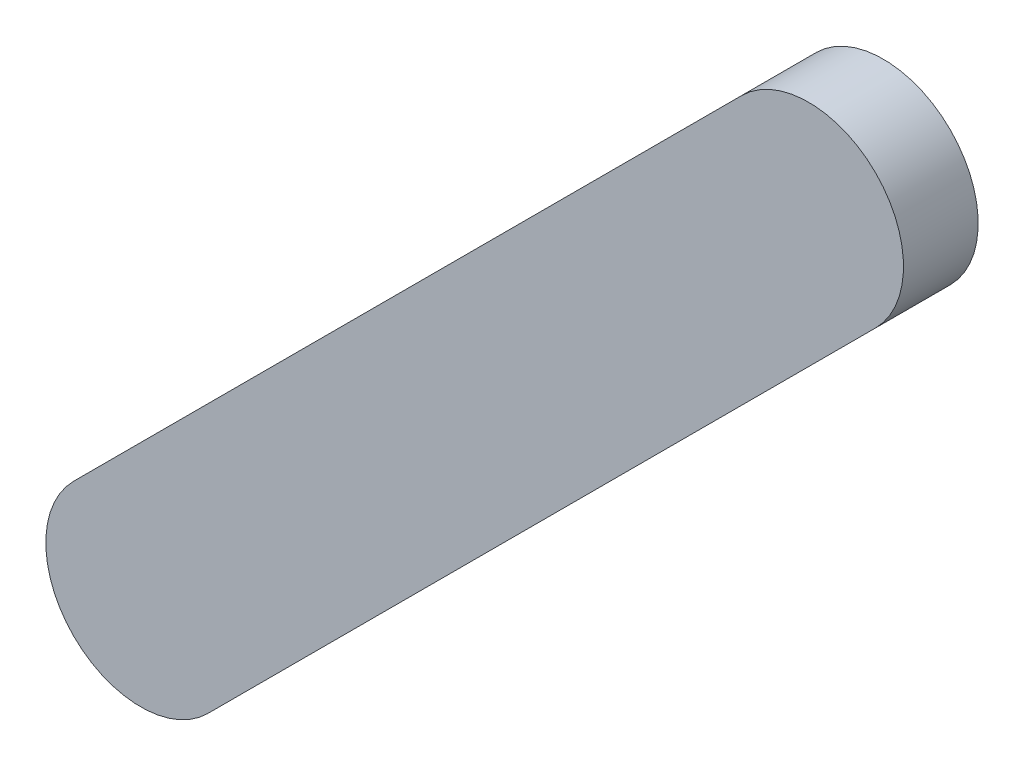
ISO-10303-21;
HEADER;
FILE_DESCRIPTION(('STEP AP214'),'2;1');
FILE_NAME('part.step','',(''),(''),'','','');
FILE_SCHEMA(('AUTOMOTIVE_DESIGN { 1 0 10303 214 1 1 1 1 }'));
ENDSEC;
DATA;
#1=APPLICATION_CONTEXT('core data for automotive mechanical design processes');
#2=APPLICATION_PROTOCOL_DEFINITION('international standard','automotive_design',2000,#1);
#3=PRODUCT_CONTEXT('',#1,'mechanical');
#4=PRODUCT('Part','Part','',(#3));
#5=PRODUCT_RELATED_PRODUCT_CATEGORY('part','',(#4));
#6=PRODUCT_DEFINITION_FORMATION('','',#4);
#7=PRODUCT_DEFINITION_CONTEXT('part definition',#1,'design');
#8=PRODUCT_DEFINITION('design','',#6,#7);
#9=PRODUCT_DEFINITION_SHAPE('','',#8);
#10=(LENGTH_UNIT() NAMED_UNIT(*) SI_UNIT(.MILLI.,.METRE.));
#11=(NAMED_UNIT(*) PLANE_ANGLE_UNIT() SI_UNIT($,.RADIAN.));
#12=(NAMED_UNIT(*) SI_UNIT($,.STERADIAN.) SOLID_ANGLE_UNIT());
#13=UNCERTAINTY_MEASURE_WITH_UNIT(LENGTH_MEASURE(1.E-05),#10,'distance_accuracy_value','');
#14=(GEOMETRIC_REPRESENTATION_CONTEXT(3) GLOBAL_UNCERTAINTY_ASSIGNED_CONTEXT((#13)) GLOBAL_UNIT_ASSIGNED_CONTEXT((#10,
#11,#12)) REPRESENTATION_CONTEXT('',''));
#15=CARTESIAN_POINT('',(0.,0.,0.));
#16=DIRECTION('',(0.,0.,1.));
#17=DIRECTION('',(1.,0.,0.));
#18=AXIS2_PLACEMENT_3D('',#15,#16,#17);
#19=CARTESIAN_POINT('',(153.9656052,101.79039586,0.));
#20=DIRECTION('',(-0.707106781186545,0.70710678118655,0.));
#21=DIRECTION('',(0.70710678118655,0.707106781186545,0.));
#22=AXIS2_PLACEMENT_3D('',#19,#20,#21);
#23=PLANE('',#22);
#24=DIRECTION('',(0.70710678118655,0.707106781186545,0.));
#25=VECTOR('',#24,1.);
#26=CARTESIAN_POINT('',(153.9656052,101.79039586,0.1999996));
#27=LINE('',#26,#25);
#28=CARTESIAN_POINT('',(153.9656052,101.79039586,0.1999996));
#29=VERTEX_POINT('',#28);
#30=CARTESIAN_POINT('',(155.75460594,103.5793966,0.1999996));
#31=VERTEX_POINT('',#30);
#32=EDGE_CURVE('E11',#29,#31,#27,.T.);
#33=ORIENTED_EDGE('',*,*,#32,.F.);
#34=DIRECTION('',(0.,0.,1.));
#35=VECTOR('',#34,1.);
#36=CARTESIAN_POINT('',(153.9656052,101.79039586,0.));
#37=LINE('',#36,#35);
#38=CARTESIAN_POINT('',(153.9656052,101.79039586,0.));
#39=VERTEX_POINT('',#38);
#40=EDGE_CURVE('E24',#39,#29,#37,.T.);
#41=ORIENTED_EDGE('',*,*,#40,.F.);
#42=DIRECTION('',(0.70710678118655,0.707106781186545,0.));
#43=VECTOR('',#42,1.);
#44=CARTESIAN_POINT('',(153.9656052,101.79039586,0.));
#45=LINE('',#44,#43);
#46=CARTESIAN_POINT('',(155.75460594,103.5793966,0.));
#47=VERTEX_POINT('',#46);
#48=EDGE_CURVE('E75',#39,#47,#45,.T.);
#49=ORIENTED_EDGE('',*,*,#48,.T.);
#50=DIRECTION('',(0.,0.,1.));
#51=VECTOR('',#50,1.);
#52=CARTESIAN_POINT('',(155.75460594,103.5793966,0.));
#53=LINE('',#52,#51);
#54=EDGE_CURVE('E37',#47,#31,#53,.T.);
#55=ORIENTED_EDGE('',*,*,#54,.T.);
#56=EDGE_LOOP('',(#33,#41,#49,#55));
#57=FACE_BOUND('',#56,.T.);
#58=ADVANCED_FACE('F17',(#57),#23,.F.);
#59=CARTESIAN_POINT('',(155.57500127,103.75900127,0.));
#60=DIRECTION('',(0.,0.,-1.));
#61=DIRECTION('',(0.707106781186548,-0.707106781186548,0.));
#62=AXIS2_PLACEMENT_3D('',#59,#60,#61);
#63=CYLINDRICAL_SURFACE('',#62,0.253999360179542);
#64=CARTESIAN_POINT('',(155.57500127,103.75900127,0.1999996));
#65=DIRECTION('',(0.,0.,1.));
#66=DIRECTION('',(0.707106781186548,-0.707106781186548,0.));
#67=AXIS2_PLACEMENT_3D('',#64,#65,#66);
#68=CIRCLE('',#67,0.253999360179542);
#69=CARTESIAN_POINT('',(155.3953966,103.93860594,0.1999996));
#70=VERTEX_POINT('',#69);
#71=EDGE_CURVE('E83',#31,#70,#68,.T.);
#72=ORIENTED_EDGE('',*,*,#71,.F.);
#73=ORIENTED_EDGE('',*,*,#54,.F.);
#74=CARTESIAN_POINT('',(155.57500127,103.75900127,0.));
#75=DIRECTION('',(0.,0.,1.));
#76=DIRECTION('',(0.707106781186548,-0.707106781186548,0.));
#77=AXIS2_PLACEMENT_3D('',#74,#75,#76);
#78=CIRCLE('',#77,0.253999360179542);
#79=CARTESIAN_POINT('',(155.3953966,103.93860594,0.));
#80=VERTEX_POINT('',#79);
#81=EDGE_CURVE('E81',#47,#80,#78,.T.);
#82=ORIENTED_EDGE('',*,*,#81,.T.);
#83=DIRECTION('',(0.,0.,1.));
#84=VECTOR('',#83,1.);
#85=CARTESIAN_POINT('',(155.3953966,103.93860594,0.));
#86=LINE('',#85,#84);
#87=EDGE_CURVE('E67',#80,#70,#86,.T.);
#88=ORIENTED_EDGE('',*,*,#87,.T.);
#89=EDGE_LOOP('',(#72,#73,#82,#88));
#90=FACE_BOUND('',#89,.T.);
#91=ADVANCED_FACE('F89',(#90),#63,.T.);
#92=CARTESIAN_POINT('',(155.3953966,103.93860594,0.));
#93=DIRECTION('',(0.707106781186545,-0.70710678118655,0.));
#94=DIRECTION('',(-0.70710678118655,-0.707106781186545,0.));
#95=AXIS2_PLACEMENT_3D('',#92,#93,#94);
#96=PLANE('',#95);
#97=DIRECTION('',(-0.70710678118655,-0.707106781186545,0.));
#98=VECTOR('',#97,1.);
#99=CARTESIAN_POINT('',(155.3953966,103.93860594,0.1999996));
#100=LINE('',#99,#98);
#101=CARTESIAN_POINT('',(153.60639586,102.1496052,0.1999996));
#102=VERTEX_POINT('',#101);
#103=EDGE_CURVE('E71',#70,#102,#100,.T.);
#104=ORIENTED_EDGE('',*,*,#103,.F.);
#105=ORIENTED_EDGE('',*,*,#87,.F.);
#106=DIRECTION('',(-0.70710678118655,-0.707106781186545,0.));
#107=VECTOR('',#106,1.);
#108=CARTESIAN_POINT('',(155.3953966,103.93860594,0.));
#109=LINE('',#108,#107);
#110=CARTESIAN_POINT('',(153.60639586,102.1496052,0.));
#111=VERTEX_POINT('',#110);
#112=EDGE_CURVE('E63',#80,#111,#109,.T.);
#113=ORIENTED_EDGE('',*,*,#112,.T.);
#114=DIRECTION('',(0.,0.,1.));
#115=VECTOR('',#114,1.);
#116=CARTESIAN_POINT('',(153.60639586,102.1496052,0.));
#117=LINE('',#116,#115);
#118=EDGE_CURVE('E53',#111,#102,#117,.T.);
#119=ORIENTED_EDGE('',*,*,#118,.T.);
#120=EDGE_LOOP('',(#104,#105,#113,#119));
#121=FACE_BOUND('',#120,.T.);
#122=ADVANCED_FACE('F66',(#121),#96,.F.);
#123=CARTESIAN_POINT('',(153.78600053,101.97000053,0.));
#124=DIRECTION('',(0.,0.,-1.));
#125=DIRECTION('',(-0.707106781186548,0.707106781186548,0.));
#126=AXIS2_PLACEMENT_3D('',#123,#124,#125);
#127=CYLINDRICAL_SURFACE('',#126,0.253999360179542);
#128=CARTESIAN_POINT('',(153.78600053,101.97000053,0.1999996));
#129=DIRECTION('',(0.,0.,1.));
#130=DIRECTION('',(-0.707106781186548,0.707106781186548,0.));
#131=AXIS2_PLACEMENT_3D('',#128,#129,#130);
#132=CIRCLE('',#131,0.253999360179542);
#133=EDGE_CURVE('E59',#102,#29,#132,.T.);
#134=ORIENTED_EDGE('',*,*,#133,.F.);
#135=ORIENTED_EDGE('',*,*,#118,.F.);
#136=CARTESIAN_POINT('',(153.78600053,101.97000053,0.));
#137=DIRECTION('',(0.,0.,1.));
#138=DIRECTION('',(-0.707106781186548,0.707106781186548,0.));
#139=AXIS2_PLACEMENT_3D('',#136,#137,#138);
#140=CIRCLE('',#139,0.253999360179542);
#141=EDGE_CURVE('E57',#111,#39,#140,.T.);
#142=ORIENTED_EDGE('',*,*,#141,.T.);
#143=ORIENTED_EDGE('',*,*,#40,.T.);
#144=EDGE_LOOP('',(#134,#135,#142,#143));
#145=FACE_BOUND('',#144,.T.);
#146=ADVANCED_FACE('F55',(#145),#127,.T.);
#147=CARTESIAN_POINT('',(153.9656052,101.79039586,0.));
#148=DIRECTION('',(0.,0.,-1.));
#149=DIRECTION('',(-1.,0.,0.));
#150=AXIS2_PLACEMENT_3D('',#147,#148,#149);
#151=PLANE('',#150);
#152=ORIENTED_EDGE('',*,*,#141,.F.);
#153=ORIENTED_EDGE('',*,*,#112,.F.);
#154=ORIENTED_EDGE('',*,*,#81,.F.);
#155=ORIENTED_EDGE('',*,*,#48,.F.);
#156=EDGE_LOOP('',(#152,#153,#154,#155));
#157=FACE_BOUND('',#156,.T.);
#158=ADVANCED_FACE('F74',(#157),#151,.T.);
#159=CARTESIAN_POINT('',(153.9656052,101.79039586,0.1999996));
#160=DIRECTION('',(0.,0.,-1.));
#161=DIRECTION('',(-1.,0.,0.));
#162=AXIS2_PLACEMENT_3D('',#159,#160,#161);
#163=PLANE('',#162);
#164=ORIENTED_EDGE('',*,*,#32,.T.);
#165=ORIENTED_EDGE('',*,*,#71,.T.);
#166=ORIENTED_EDGE('',*,*,#103,.T.);
#167=ORIENTED_EDGE('',*,*,#133,.T.);
#168=EDGE_LOOP('',(#164,#165,#166,#167));
#169=FACE_BOUND('',#168,.T.);
#170=ADVANCED_FACE('F91',(#169),#163,.F.);
#171=CLOSED_SHELL('',(#58,#91,#122,#146,#158,#170));
#172=MANIFOLD_SOLID_BREP('B1',#171);
#173=ADVANCED_BREP_SHAPE_REPRESENTATION('',(#18,#172),#14);
#174=SHAPE_DEFINITION_REPRESENTATION(#9,#173);
ENDSEC;
END-ISO-10303-21;
